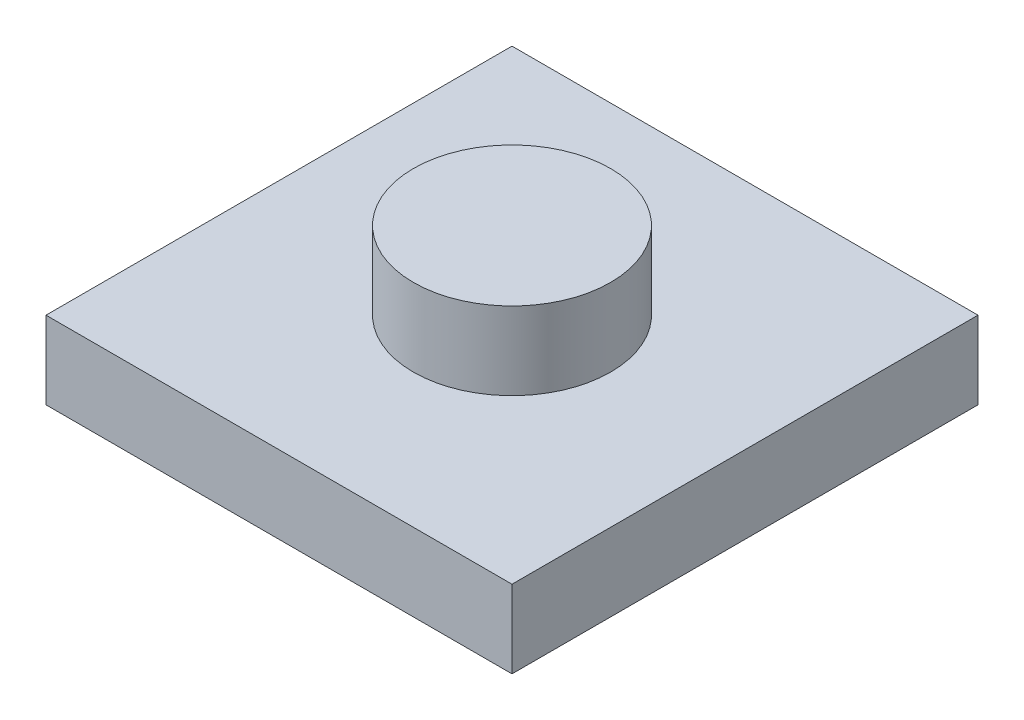
ISO-10303-21;
HEADER;
FILE_DESCRIPTION(('STEP AP214'),'2;1');
FILE_NAME('part.step','',(''),(''),'','','');
FILE_SCHEMA(('AUTOMOTIVE_DESIGN { 1 0 10303 214 1 1 1 1 }'));
ENDSEC;
DATA;
#1=APPLICATION_CONTEXT('core data for automotive mechanical design processes');
#2=APPLICATION_PROTOCOL_DEFINITION('international standard','automotive_design',2000,#1);
#3=PRODUCT_CONTEXT('',#1,'mechanical');
#4=PRODUCT('Part','Part','',(#3));
#5=PRODUCT_RELATED_PRODUCT_CATEGORY('part','',(#4));
#6=PRODUCT_DEFINITION_FORMATION('','',#4);
#7=PRODUCT_DEFINITION_CONTEXT('part definition',#1,'design');
#8=PRODUCT_DEFINITION('design','',#6,#7);
#9=PRODUCT_DEFINITION_SHAPE('','',#8);
#10=(LENGTH_UNIT() NAMED_UNIT(*) SI_UNIT(.MILLI.,.METRE.));
#11=(NAMED_UNIT(*) PLANE_ANGLE_UNIT() SI_UNIT($,.RADIAN.));
#12=(NAMED_UNIT(*) SI_UNIT($,.STERADIAN.) SOLID_ANGLE_UNIT());
#13=UNCERTAINTY_MEASURE_WITH_UNIT(LENGTH_MEASURE(1.E-05),#10,'distance_accuracy_value','');
#14=(GEOMETRIC_REPRESENTATION_CONTEXT(3) GLOBAL_UNCERTAINTY_ASSIGNED_CONTEXT((#13)) GLOBAL_UNIT_ASSIGNED_CONTEXT((#10,
#11,#12)) REPRESENTATION_CONTEXT('',''));
#15=CARTESIAN_POINT('',(0.,0.,0.));
#16=DIRECTION('',(0.,0.,1.));
#17=DIRECTION('',(1.,0.,0.));
#18=AXIS2_PLACEMENT_3D('',#15,#16,#17);
#19=CARTESIAN_POINT('',(0.,15.,0.));
#20=DIRECTION('',(0.,1.,0.));
#21=DIRECTION('',(0.,0.,1.));
#22=AXIS2_PLACEMENT_3D('',#19,#20,#21);
#23=PLANE('',#22);
#24=DIRECTION('',(0.,0.,1.));
#25=VECTOR('',#24,1.);
#26=CARTESIAN_POINT('',(-45.,15.,45.));
#27=LINE('',#26,#25);
#28=CARTESIAN_POINT('',(-45.,15.,-45.));
#29=VERTEX_POINT('',#28);
#30=CARTESIAN_POINT('',(-45.,15.,45.));
#31=VERTEX_POINT('',#30);
#32=EDGE_CURVE('E91',#29,#31,#27,.T.);
#33=ORIENTED_EDGE('',*,*,#32,.T.);
#34=DIRECTION('',(1.,0.,0.));
#35=VECTOR('',#34,1.);
#36=CARTESIAN_POINT('',(45.,15.,45.));
#37=LINE('',#36,#35);
#38=CARTESIAN_POINT('',(45.,15.,45.));
#39=VERTEX_POINT('',#38);
#40=EDGE_CURVE('E86',#31,#39,#37,.T.);
#41=ORIENTED_EDGE('',*,*,#40,.T.);
#42=DIRECTION('',(0.,0.,-1.));
#43=VECTOR('',#42,1.);
#44=CARTESIAN_POINT('',(45.,15.,45.));
#45=LINE('',#44,#43);
#46=CARTESIAN_POINT('',(45.,15.,-45.));
#47=VERTEX_POINT('',#46);
#48=EDGE_CURVE('E89',#39,#47,#45,.T.);
#49=ORIENTED_EDGE('',*,*,#48,.T.);
#50=DIRECTION('',(-1.,0.,0.));
#51=VECTOR('',#50,1.);
#52=CARTESIAN_POINT('',(45.,15.,-45.));
#53=LINE('',#52,#51);
#54=EDGE_CURVE('E56',#47,#29,#53,.T.);
#55=ORIENTED_EDGE('',*,*,#54,.T.);
#56=EDGE_LOOP('',(#33,#41,#49,#55));
#57=FACE_BOUND('',#56,.T.);
#58=CARTESIAN_POINT('',(0.,15.,0.));
#59=DIRECTION('',(0.,1.,0.));
#60=DIRECTION('',(0.,0.,1.));
#61=AXIS2_PLACEMENT_3D('',#58,#59,#60);
#62=CIRCLE('',#61,19.05);
#63=CARTESIAN_POINT('',(0.,15.,19.05));
#64=VERTEX_POINT('',#63);
#65=EDGE_CURVE('E106',#64,#64,#62,.T.);
#66=ORIENTED_EDGE('',*,*,#65,.F.);
#67=EDGE_LOOP('',(#66));
#68=FACE_BOUND('',#67,.T.);
#69=ADVANCED_FACE('F39',(#57,#68),#23,.T.);
#70=CARTESIAN_POINT('',(0.,0.,0.));
#71=DIRECTION('',(0.,1.,0.));
#72=DIRECTION('',(0.,0.,1.));
#73=AXIS2_PLACEMENT_3D('',#70,#71,#72);
#74=PLANE('',#73);
#75=DIRECTION('',(0.,0.,1.));
#76=VECTOR('',#75,1.);
#77=CARTESIAN_POINT('',(-45.,0.,45.));
#78=LINE('',#77,#76);
#79=CARTESIAN_POINT('',(-45.,0.,-45.));
#80=VERTEX_POINT('',#79);
#81=CARTESIAN_POINT('',(-45.,0.,45.));
#82=VERTEX_POINT('',#81);
#83=EDGE_CURVE('E103',#80,#82,#78,.T.);
#84=ORIENTED_EDGE('',*,*,#83,.F.);
#85=DIRECTION('',(-1.,0.,0.));
#86=VECTOR('',#85,1.);
#87=CARTESIAN_POINT('',(45.,0.,-45.));
#88=LINE('',#87,#86);
#89=CARTESIAN_POINT('',(45.,0.,-45.));
#90=VERTEX_POINT('',#89);
#91=EDGE_CURVE('E79',#90,#80,#88,.T.);
#92=ORIENTED_EDGE('',*,*,#91,.F.);
#93=DIRECTION('',(0.,0.,-1.));
#94=VECTOR('',#93,1.);
#95=CARTESIAN_POINT('',(45.,0.,45.));
#96=LINE('',#95,#94);
#97=CARTESIAN_POINT('',(45.,0.,45.));
#98=VERTEX_POINT('',#97);
#99=EDGE_CURVE('E73',#98,#90,#96,.T.);
#100=ORIENTED_EDGE('',*,*,#99,.F.);
#101=DIRECTION('',(1.,0.,0.));
#102=VECTOR('',#101,1.);
#103=CARTESIAN_POINT('',(45.,0.,45.));
#104=LINE('',#103,#102);
#105=EDGE_CURVE('E95',#82,#98,#104,.T.);
#106=ORIENTED_EDGE('',*,*,#105,.F.);
#107=EDGE_LOOP('',(#84,#92,#100,#106));
#108=FACE_BOUND('',#107,.T.);
#109=ADVANCED_FACE('F114',(#108),#74,.F.);
#110=CARTESIAN_POINT('',(-45.,15.,45.));
#111=DIRECTION('',(1.,0.,0.));
#112=DIRECTION('',(0.,0.,-1.));
#113=AXIS2_PLACEMENT_3D('',#110,#111,#112);
#114=PLANE('',#113);
#115=ORIENTED_EDGE('',*,*,#83,.T.);
#116=DIRECTION('',(0.,-1.,0.));
#117=VECTOR('',#116,1.);
#118=CARTESIAN_POINT('',(-45.,15.,45.));
#119=LINE('',#118,#117);
#120=EDGE_CURVE('E11',#31,#82,#119,.T.);
#121=ORIENTED_EDGE('',*,*,#120,.F.);
#122=ORIENTED_EDGE('',*,*,#32,.F.);
#123=DIRECTION('',(0.,-1.,0.));
#124=VECTOR('',#123,1.);
#125=CARTESIAN_POINT('',(-45.,15.,-45.));
#126=LINE('',#125,#124);
#127=EDGE_CURVE('E99',#29,#80,#126,.T.);
#128=ORIENTED_EDGE('',*,*,#127,.T.);
#129=EDGE_LOOP('',(#115,#121,#122,#128));
#130=FACE_BOUND('',#129,.T.);
#131=ADVANCED_FACE('F41',(#130),#114,.F.);
#132=CARTESIAN_POINT('',(45.,15.,45.));
#133=DIRECTION('',(0.,0.,-1.));
#134=DIRECTION('',(-1.,0.,0.));
#135=AXIS2_PLACEMENT_3D('',#132,#133,#134);
#136=PLANE('',#135);
#137=ORIENTED_EDGE('',*,*,#105,.T.);
#138=DIRECTION('',(0.,-1.,0.));
#139=VECTOR('',#138,1.);
#140=CARTESIAN_POINT('',(45.,15.,45.));
#141=LINE('',#140,#139);
#142=EDGE_CURVE('E48',#39,#98,#141,.T.);
#143=ORIENTED_EDGE('',*,*,#142,.F.);
#144=ORIENTED_EDGE('',*,*,#40,.F.);
#145=ORIENTED_EDGE('',*,*,#120,.T.);
#146=EDGE_LOOP('',(#137,#143,#144,#145));
#147=FACE_BOUND('',#146,.T.);
#148=ADVANCED_FACE('F94',(#147),#136,.F.);
#149=CARTESIAN_POINT('',(45.,15.,45.));
#150=DIRECTION('',(-1.,0.,0.));
#151=DIRECTION('',(0.,0.,1.));
#152=AXIS2_PLACEMENT_3D('',#149,#150,#151);
#153=PLANE('',#152);
#154=ORIENTED_EDGE('',*,*,#99,.T.);
#155=DIRECTION('',(0.,-1.,0.));
#156=VECTOR('',#155,1.);
#157=CARTESIAN_POINT('',(45.,15.,-45.));
#158=LINE('',#157,#156);
#159=EDGE_CURVE('E96',#47,#90,#158,.T.);
#160=ORIENTED_EDGE('',*,*,#159,.F.);
#161=ORIENTED_EDGE('',*,*,#48,.F.);
#162=ORIENTED_EDGE('',*,*,#142,.T.);
#163=EDGE_LOOP('',(#154,#160,#161,#162));
#164=FACE_BOUND('',#163,.T.);
#165=ADVANCED_FACE('F97',(#164),#153,.F.);
#166=CARTESIAN_POINT('',(45.,15.,-45.));
#167=DIRECTION('',(0.,0.,1.));
#168=DIRECTION('',(1.,0.,0.));
#169=AXIS2_PLACEMENT_3D('',#166,#167,#168);
#170=PLANE('',#169);
#171=ORIENTED_EDGE('',*,*,#91,.T.);
#172=ORIENTED_EDGE('',*,*,#127,.F.);
#173=ORIENTED_EDGE('',*,*,#54,.F.);
#174=ORIENTED_EDGE('',*,*,#159,.T.);
#175=EDGE_LOOP('',(#171,#172,#173,#174));
#176=FACE_BOUND('',#175,.T.);
#177=ADVANCED_FACE('F111',(#176),#170,.F.);
#178=CARTESIAN_POINT('',(0.,30.,0.));
#179=DIRECTION('',(0.,-1.,0.));
#180=DIRECTION('',(0.,0.,-1.));
#181=AXIS2_PLACEMENT_3D('',#178,#179,#180);
#182=CYLINDRICAL_SURFACE('',#181,19.05);
#183=ORIENTED_EDGE('',*,*,#65,.T.);
#184=EDGE_LOOP('',(#183));
#185=FACE_BOUND('',#184,.T.);
#186=CARTESIAN_POINT('',(0.,30.,0.));
#187=DIRECTION('',(0.,1.,0.));
#188=DIRECTION('',(0.,0.,1.));
#189=AXIS2_PLACEMENT_3D('',#186,#187,#188);
#190=CIRCLE('',#189,19.05);
#191=CARTESIAN_POINT('',(0.,30.,19.05));
#192=VERTEX_POINT('',#191);
#193=EDGE_CURVE('E119',#192,#192,#190,.T.);
#194=ORIENTED_EDGE('',*,*,#193,.F.);
#195=EDGE_LOOP('',(#194));
#196=FACE_BOUND('',#195,.T.);
#197=ADVANCED_FACE('F125',(#185,#196),#182,.T.);
#198=CARTESIAN_POINT('',(0.,30.,0.));
#199=DIRECTION('',(0.,1.,0.));
#200=DIRECTION('',(0.,0.,1.));
#201=AXIS2_PLACEMENT_3D('',#198,#199,#200);
#202=PLANE('',#201);
#203=ORIENTED_EDGE('',*,*,#193,.T.);
#204=EDGE_LOOP('',(#203));
#205=FACE_BOUND('',#204,.T.);
#206=ADVANCED_FACE('F123',(#205),#202,.T.);
#207=CLOSED_SHELL('',(#69,#109,#131,#148,#165,#177,#197,#206));
#208=MANIFOLD_SOLID_BREP('B2',#207);
#209=ADVANCED_BREP_SHAPE_REPRESENTATION('',(#18,#208),#14);
#210=SHAPE_DEFINITION_REPRESENTATION(#9,#209);
ENDSEC;
END-ISO-10303-21;
